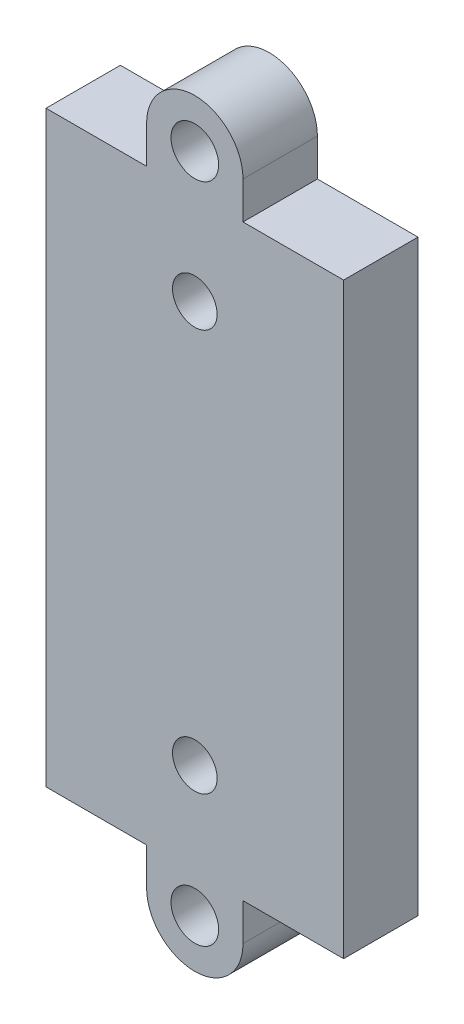
ISO-10303-21;
HEADER;
FILE_DESCRIPTION(('STEP AP214'),'2;1');
FILE_NAME('part.step','',(''),(''),'','','');
FILE_SCHEMA(('AUTOMOTIVE_DESIGN { 1 0 10303 214 1 1 1 1 }'));
ENDSEC;
DATA;
#1=APPLICATION_CONTEXT('core data for automotive mechanical design processes');
#2=APPLICATION_PROTOCOL_DEFINITION('international standard','automotive_design',2000,#1);
#3=PRODUCT_CONTEXT('',#1,'mechanical');
#4=PRODUCT('Part','Part','',(#3));
#5=PRODUCT_RELATED_PRODUCT_CATEGORY('part','',(#4));
#6=PRODUCT_DEFINITION_FORMATION('','',#4);
#7=PRODUCT_DEFINITION_CONTEXT('part definition',#1,'design');
#8=PRODUCT_DEFINITION('design','',#6,#7);
#9=PRODUCT_DEFINITION_SHAPE('','',#8);
#10=(LENGTH_UNIT() NAMED_UNIT(*) SI_UNIT(.MILLI.,.METRE.));
#11=(NAMED_UNIT(*) PLANE_ANGLE_UNIT() SI_UNIT($,.RADIAN.));
#12=(NAMED_UNIT(*) SI_UNIT($,.STERADIAN.) SOLID_ANGLE_UNIT());
#13=UNCERTAINTY_MEASURE_WITH_UNIT(LENGTH_MEASURE(1.E-05),#10,'distance_accuracy_value','');
#14=(GEOMETRIC_REPRESENTATION_CONTEXT(3) GLOBAL_UNCERTAINTY_ASSIGNED_CONTEXT((#13)) GLOBAL_UNIT_ASSIGNED_CONTEXT((#10,
#11,#12)) REPRESENTATION_CONTEXT('',''));
#15=CARTESIAN_POINT('',(0.,0.,0.));
#16=DIRECTION('',(0.,0.,1.));
#17=DIRECTION('',(1.,0.,0.));
#18=AXIS2_PLACEMENT_3D('',#15,#16,#17);
#19=CARTESIAN_POINT('',(-21.5845968576232,-26.2971291866029,5.));
#20=DIRECTION('',(0.,1.,0.));
#21=DIRECTION('',(-1.,0.,0.));
#22=AXIS2_PLACEMENT_3D('',#19,#20,#21);
#23=PLANE('',#22);
#24=DIRECTION('',(1.,0.,0.));
#25=VECTOR('',#24,1.);
#26=CARTESIAN_POINT('',(-21.5845968576232,-26.2971291866029,5.));
#27=LINE('',#26,#25);
#28=CARTESIAN_POINT('',(-5.84459685762318,-26.2971291866029,5.));
#29=VERTEX_POINT('',#28);
#30=CARTESIAN_POINT('',(0.915403142376816,-26.2971291866029,5.));
#31=VERTEX_POINT('',#30);
#32=EDGE_CURVE('E54',#29,#31,#27,.T.);
#33=ORIENTED_EDGE('',*,*,#32,.F.);
#34=DIRECTION('',(0.,0.,-1.));
#35=VECTOR('',#34,1.);
#36=CARTESIAN_POINT('',(-5.84459685762318,-26.2971291866029,5.));
#37=LINE('',#36,#35);
#38=CARTESIAN_POINT('',(-5.84459685762318,-26.2971291866029,0.));
#39=VERTEX_POINT('',#38);
#40=EDGE_CURVE('E11',#29,#39,#37,.T.);
#41=ORIENTED_EDGE('',*,*,#40,.T.);
#42=DIRECTION('',(1.,0.,0.));
#43=VECTOR('',#42,1.);
#44=CARTESIAN_POINT('',(-21.5845968576232,-26.2971291866029,0.));
#45=LINE('',#44,#43);
#46=CARTESIAN_POINT('',(0.915403142376817,-26.2971291866029,0.));
#47=VERTEX_POINT('',#46);
#48=EDGE_CURVE('E204',#39,#47,#45,.T.);
#49=ORIENTED_EDGE('',*,*,#48,.T.);
#50=DIRECTION('',(0.,0.,-1.));
#51=VECTOR('',#50,1.);
#52=CARTESIAN_POINT('',(0.915403142376816,-26.2971291866029,5.));
#53=LINE('',#52,#51);
#54=EDGE_CURVE('E195',#31,#47,#53,.T.);
#55=ORIENTED_EDGE('',*,*,#54,.F.);
#56=EDGE_LOOP('',(#33,#41,#49,#55));
#57=FACE_BOUND('',#56,.T.);
#58=ADVANCED_FACE('F32',(#57),#23,.F.);
#59=CARTESIAN_POINT('',(-4.03454117826684,-8.29712918660287,5.));
#60=DIRECTION('',(0.,0.,1.));
#61=DIRECTION('',(1.,0.,0.));
#62=AXIS2_PLACEMENT_3D('',#59,#60,#61);
#63=PLANE('',#62);
#64=CARTESIAN_POINT('',(-9.08459685762318,-20.0471291866029,5.));
#65=DIRECTION('',(0.,0.,1.));
#66=DIRECTION('',(1.,0.,0.));
#67=AXIS2_PLACEMENT_3D('',#64,#65,#66);
#68=CIRCLE('',#67,1.5);
#69=CARTESIAN_POINT('',(-7.58459685762318,-20.0471291866029,5.));
#70=VERTEX_POINT('',#69);
#71=EDGE_CURVE('E277',#70,#70,#68,.T.);
#72=ORIENTED_EDGE('',*,*,#71,.F.);
#73=EDGE_LOOP('',(#72));
#74=FACE_BOUND('',#73,.T.);
#75=CARTESIAN_POINT('',(-9.08459685762319,6.95287081339712,5.));
#76=DIRECTION('',(0.,0.,1.));
#77=DIRECTION('',(1.,0.,0.));
#78=AXIS2_PLACEMENT_3D('',#75,#76,#77);
#79=CIRCLE('',#78,1.5);
#80=CARTESIAN_POINT('',(-7.58459685762319,6.95287081339712,5.));
#81=VERTEX_POINT('',#80);
#82=EDGE_CURVE('E280',#81,#81,#79,.T.);
#83=ORIENTED_EDGE('',*,*,#82,.F.);
#84=EDGE_LOOP('',(#83));
#85=FACE_BOUND('',#84,.T.);
#86=DIRECTION('',(1.,0.,0.));
#87=VECTOR('',#86,1.);
#88=CARTESIAN_POINT('',(-19.0845968576232,13.2028708133971,5.));
#89=LINE('',#88,#87);
#90=CARTESIAN_POINT('',(-5.84459685762319,13.2028708133971,5.));
#91=VERTEX_POINT('',#90);
#92=CARTESIAN_POINT('',(0.915403142376817,13.2028708133971,5.));
#93=VERTEX_POINT('',#92);
#94=EDGE_CURVE('E153',#91,#93,#89,.T.);
#95=ORIENTED_EDGE('',*,*,#94,.F.);
#96=DIRECTION('',(0.,-1.,0.));
#97=VECTOR('',#96,1.);
#98=CARTESIAN_POINT('',(-5.84459685762319,13.2028708133971,5.));
#99=LINE('',#98,#97);
#100=CARTESIAN_POINT('',(-5.84459685762319,15.7028708133971,5.));
#101=VERTEX_POINT('',#100);
#102=EDGE_CURVE('E134',#101,#91,#99,.T.);
#103=ORIENTED_EDGE('',*,*,#102,.F.);
#104=CARTESIAN_POINT('',(-9.08459685762319,15.7028708133971,5.));
#105=DIRECTION('',(0.,0.,-1.));
#106=DIRECTION('',(1.,0.,0.));
#107=AXIS2_PLACEMENT_3D('',#104,#105,#106);
#108=CIRCLE('',#107,3.24);
#109=CARTESIAN_POINT('',(-12.3245968576232,15.7028708133971,5.));
#110=VERTEX_POINT('',#109);
#111=EDGE_CURVE('E146',#110,#101,#108,.T.);
#112=ORIENTED_EDGE('',*,*,#111,.F.);
#113=DIRECTION('',(0.,1.,0.));
#114=VECTOR('',#113,1.);
#115=CARTESIAN_POINT('',(-12.3245968576232,15.7028708133971,5.));
#116=LINE('',#115,#114);
#117=CARTESIAN_POINT('',(-12.3245968576232,13.2028708133971,5.));
#118=VERTEX_POINT('',#117);
#119=EDGE_CURVE('E126',#118,#110,#116,.T.);
#120=ORIENTED_EDGE('',*,*,#119,.F.);
#121=CARTESIAN_POINT('',(-19.0845968576232,13.2028708133971,5.));
#122=VERTEX_POINT('',#121);
#123=EDGE_CURVE('E143',#122,#118,#89,.T.);
#124=ORIENTED_EDGE('',*,*,#123,.F.);
#125=DIRECTION('',(0.,-1.,0.));
#126=VECTOR('',#125,1.);
#127=CARTESIAN_POINT('',(-19.0845968576232,-28.9494172005716,5.));
#128=LINE('',#127,#126);
#129=CARTESIAN_POINT('',(-19.0845968576232,-26.2971291866029,5.));
#130=VERTEX_POINT('',#129);
#131=EDGE_CURVE('E199',#122,#130,#128,.T.);
#132=ORIENTED_EDGE('',*,*,#131,.T.);
#133=CARTESIAN_POINT('',(-12.3245968576232,-26.2971291866029,5.));
#134=VERTEX_POINT('',#133);
#135=EDGE_CURVE('E205',#130,#134,#27,.T.);
#136=ORIENTED_EDGE('',*,*,#135,.T.);
#137=DIRECTION('',(0.,1.,0.));
#138=VECTOR('',#137,1.);
#139=CARTESIAN_POINT('',(-12.3245968576232,-28.7971291866029,5.));
#140=LINE('',#139,#138);
#141=CARTESIAN_POINT('',(-12.3245968576232,-28.7971291866029,5.));
#142=VERTEX_POINT('',#141);
#143=EDGE_CURVE('E179',#142,#134,#140,.T.);
#144=ORIENTED_EDGE('',*,*,#143,.F.);
#145=CARTESIAN_POINT('',(-9.08459685762318,-28.7971291866029,5.));
#146=DIRECTION('',(0.,0.,-1.));
#147=DIRECTION('',(-1.,0.,0.));
#148=AXIS2_PLACEMENT_3D('',#145,#146,#147);
#149=CIRCLE('',#148,3.24);
#150=CARTESIAN_POINT('',(-5.84459685762318,-28.7971291866029,5.));
#151=VERTEX_POINT('',#150);
#152=EDGE_CURVE('E176',#151,#142,#149,.T.);
#153=ORIENTED_EDGE('',*,*,#152,.F.);
#154=DIRECTION('',(0.,-1.,0.));
#155=VECTOR('',#154,1.);
#156=CARTESIAN_POINT('',(-5.84459685762318,-28.7971291866029,5.));
#157=LINE('',#156,#155);
#158=EDGE_CURVE('E183',#29,#151,#157,.T.);
#159=ORIENTED_EDGE('',*,*,#158,.F.);
#160=ORIENTED_EDGE('',*,*,#32,.T.);
#161=DIRECTION('',(0.,-1.,0.));
#162=VECTOR('',#161,1.);
#163=CARTESIAN_POINT('',(0.915403142376817,-8.29712918660287,5.));
#164=LINE('',#163,#162);
#165=EDGE_CURVE('E167',#93,#31,#164,.T.);
#166=ORIENTED_EDGE('',*,*,#165,.F.);
#167=EDGE_LOOP('',(#95,#103,#112,#120,#124,#132,#136,#144,#153,#159,#160,#166));
#168=FACE_BOUND('',#167,.T.);
#169=CARTESIAN_POINT('',(-9.08459685762318,-28.7971291866029,5.));
#170=DIRECTION('',(0.,0.,-1.));
#171=DIRECTION('',(-1.,0.,0.));
#172=AXIS2_PLACEMENT_3D('',#169,#170,#171);
#173=CIRCLE('',#172,1.6);
#174=CARTESIAN_POINT('',(-10.6845968576232,-28.7971291866029,5.));
#175=VERTEX_POINT('',#174);
#176=EDGE_CURVE('E170',#175,#175,#173,.T.);
#177=ORIENTED_EDGE('',*,*,#176,.T.);
#178=EDGE_LOOP('',(#177));
#179=FACE_BOUND('',#178,.T.);
#180=CARTESIAN_POINT('',(-9.08459685762319,15.7028708133971,5.));
#181=DIRECTION('',(0.,0.,-1.));
#182=DIRECTION('',(1.,0.,0.));
#183=AXIS2_PLACEMENT_3D('',#180,#181,#182);
#184=CIRCLE('',#183,1.6);
#185=CARTESIAN_POINT('',(-7.48459685762319,15.7028708133971,5.));
#186=VERTEX_POINT('',#185);
#187=EDGE_CURVE('E249',#186,#186,#184,.T.);
#188=ORIENTED_EDGE('',*,*,#187,.T.);
#189=EDGE_LOOP('',(#188));
#190=FACE_BOUND('',#189,.T.);
#191=ADVANCED_FACE('F140',(#74,#85,#168,#179,#190),#63,.T.);
#192=CARTESIAN_POINT('',(-4.03454117826684,-8.29712918660287,0.));
#193=DIRECTION('',(0.,0.,1.));
#194=DIRECTION('',(1.,0.,0.));
#195=AXIS2_PLACEMENT_3D('',#192,#193,#194);
#196=PLANE('',#195);
#197=CARTESIAN_POINT('',(-9.08459685762319,6.95287081339712,0.));
#198=DIRECTION('',(0.,0.,-1.));
#199=DIRECTION('',(1.,0.,0.));
#200=AXIS2_PLACEMENT_3D('',#197,#198,#199);
#201=CIRCLE('',#200,1.5);
#202=CARTESIAN_POINT('',(-7.58459685762319,6.95287081339712,0.));
#203=VERTEX_POINT('',#202);
#204=EDGE_CURVE('E287',#203,#203,#201,.T.);
#205=ORIENTED_EDGE('',*,*,#204,.F.);
#206=EDGE_LOOP('',(#205));
#207=FACE_BOUND('',#206,.T.);
#208=DIRECTION('',(0.,-1.,0.));
#209=VECTOR('',#208,1.);
#210=CARTESIAN_POINT('',(-5.84459685762319,13.2028708133971,0.));
#211=LINE('',#210,#209);
#212=CARTESIAN_POINT('',(-5.84459685762319,15.7028708133971,0.));
#213=VERTEX_POINT('',#212);
#214=CARTESIAN_POINT('',(-5.84459685762319,13.2028708133971,0.));
#215=VERTEX_POINT('',#214);
#216=EDGE_CURVE('E147',#213,#215,#211,.T.);
#217=ORIENTED_EDGE('',*,*,#216,.T.);
#218=DIRECTION('',(1.,0.,0.));
#219=VECTOR('',#218,1.);
#220=CARTESIAN_POINT('',(-19.0845968576232,13.2028708133971,0.));
#221=LINE('',#220,#219);
#222=CARTESIAN_POINT('',(0.915403142376817,13.2028708133971,0.));
#223=VERTEX_POINT('',#222);
#224=EDGE_CURVE('E161',#215,#223,#221,.T.);
#225=ORIENTED_EDGE('',*,*,#224,.T.);
#226=DIRECTION('',(0.,1.,0.));
#227=VECTOR('',#226,1.);
#228=CARTESIAN_POINT('',(0.915403142376817,-33.6306965097861,0.));
#229=LINE('',#228,#227);
#230=EDGE_CURVE('E163',#47,#223,#229,.T.);
#231=ORIENTED_EDGE('',*,*,#230,.F.);
#232=ORIENTED_EDGE('',*,*,#48,.F.);
#233=DIRECTION('',(0.,-1.,0.));
#234=VECTOR('',#233,1.);
#235=CARTESIAN_POINT('',(-5.84459685762318,-28.7971291866029,0.));
#236=LINE('',#235,#234);
#237=CARTESIAN_POINT('',(-5.84459685762318,-28.7971291866029,0.));
#238=VERTEX_POINT('',#237);
#239=EDGE_CURVE('E180',#39,#238,#236,.T.);
#240=ORIENTED_EDGE('',*,*,#239,.T.);
#241=CARTESIAN_POINT('',(-9.08459685762318,-28.7971291866029,0.));
#242=DIRECTION('',(0.,0.,-1.));
#243=DIRECTION('',(-1.,0.,0.));
#244=AXIS2_PLACEMENT_3D('',#241,#242,#243);
#245=CIRCLE('',#244,3.24);
#246=CARTESIAN_POINT('',(-12.3245968576232,-28.7971291866029,0.));
#247=VERTEX_POINT('',#246);
#248=EDGE_CURVE('E173',#238,#247,#245,.T.);
#249=ORIENTED_EDGE('',*,*,#248,.T.);
#250=DIRECTION('',(0.,1.,0.));
#251=VECTOR('',#250,1.);
#252=CARTESIAN_POINT('',(-12.3245968576232,-28.7971291866029,0.));
#253=LINE('',#252,#251);
#254=CARTESIAN_POINT('',(-12.3245968576232,-26.2971291866029,0.));
#255=VERTEX_POINT('',#254);
#256=EDGE_CURVE('E188',#247,#255,#253,.T.);
#257=ORIENTED_EDGE('',*,*,#256,.T.);
#258=CARTESIAN_POINT('',(-19.0845968576232,-26.2971291866029,0.));
#259=VERTEX_POINT('',#258);
#260=EDGE_CURVE('E47',#259,#255,#45,.T.);
#261=ORIENTED_EDGE('',*,*,#260,.F.);
#262=DIRECTION('',(0.,-1.,0.));
#263=VECTOR('',#262,1.);
#264=CARTESIAN_POINT('',(-19.0845968576232,-28.9494172005716,0.));
#265=LINE('',#264,#263);
#266=CARTESIAN_POINT('',(-19.0845968576232,13.2028708133971,0.));
#267=VERTEX_POINT('',#266);
#268=EDGE_CURVE('E198',#267,#259,#265,.T.);
#269=ORIENTED_EDGE('',*,*,#268,.F.);
#270=CARTESIAN_POINT('',(-12.3245968576232,13.2028708133971,0.));
#271=VERTEX_POINT('',#270);
#272=EDGE_CURVE('E157',#267,#271,#221,.T.);
#273=ORIENTED_EDGE('',*,*,#272,.T.);
#274=DIRECTION('',(0.,1.,0.));
#275=VECTOR('',#274,1.);
#276=CARTESIAN_POINT('',(-12.3245968576232,15.7028708133971,0.));
#277=LINE('',#276,#275);
#278=CARTESIAN_POINT('',(-12.3245968576232,15.7028708133971,0.));
#279=VERTEX_POINT('',#278);
#280=EDGE_CURVE('E128',#271,#279,#277,.T.);
#281=ORIENTED_EDGE('',*,*,#280,.T.);
#282=CARTESIAN_POINT('',(-9.08459685762319,15.7028708133971,0.));
#283=DIRECTION('',(0.,0.,-1.));
#284=DIRECTION('',(1.,0.,0.));
#285=AXIS2_PLACEMENT_3D('',#282,#283,#284);
#286=CIRCLE('',#285,3.24);
#287=EDGE_CURVE('E248',#279,#213,#286,.T.);
#288=ORIENTED_EDGE('',*,*,#287,.T.);
#289=EDGE_LOOP('',(#217,#225,#231,#232,#240,#249,#257,#261,#269,#273,#281,#288));
#290=FACE_BOUND('',#289,.T.);
#291=CARTESIAN_POINT('',(-9.08459685762318,-20.0471291866029,0.));
#292=DIRECTION('',(0.,0.,-1.));
#293=DIRECTION('',(-1.,0.,0.));
#294=AXIS2_PLACEMENT_3D('',#291,#292,#293);
#295=CIRCLE('',#294,1.5);
#296=CARTESIAN_POINT('',(-10.5845968576232,-20.0471291866029,0.));
#297=VERTEX_POINT('',#296);
#298=EDGE_CURVE('E282',#297,#297,#295,.T.);
#299=ORIENTED_EDGE('',*,*,#298,.F.);
#300=EDGE_LOOP('',(#299));
#301=FACE_BOUND('',#300,.T.);
#302=CARTESIAN_POINT('',(-9.08459685762318,-28.7971291866029,0.));
#303=DIRECTION('',(0.,0.,-1.));
#304=DIRECTION('',(-1.,0.,0.));
#305=AXIS2_PLACEMENT_3D('',#302,#303,#304);
#306=CIRCLE('',#305,1.6);
#307=CARTESIAN_POINT('',(-10.6845968576232,-28.7971291866029,0.));
#308=VERTEX_POINT('',#307);
#309=EDGE_CURVE('E169',#308,#308,#306,.T.);
#310=ORIENTED_EDGE('',*,*,#309,.F.);
#311=EDGE_LOOP('',(#310));
#312=FACE_BOUND('',#311,.T.);
#313=CARTESIAN_POINT('',(-9.08459685762319,15.7028708133971,0.));
#314=DIRECTION('',(0.,0.,-1.));
#315=DIRECTION('',(1.,0.,0.));
#316=AXIS2_PLACEMENT_3D('',#313,#314,#315);
#317=CIRCLE('',#316,1.6);
#318=CARTESIAN_POINT('',(-7.48459685762319,15.7028708133971,0.));
#319=VERTEX_POINT('',#318);
#320=EDGE_CURVE('E284',#319,#319,#317,.T.);
#321=ORIENTED_EDGE('',*,*,#320,.F.);
#322=EDGE_LOOP('',(#321));
#323=FACE_BOUND('',#322,.T.);
#324=ADVANCED_FACE('F34',(#207,#290,#301,#312,#323),#196,.F.);
#325=ORIENTED_EDGE('',*,*,#260,.T.);
#326=DIRECTION('',(0.,0.,1.));
#327=VECTOR('',#326,1.);
#328=CARTESIAN_POINT('',(-12.3245968576232,-26.2971291866029,5.));
#329=LINE('',#328,#327);
#330=EDGE_CURVE('E40',#255,#134,#329,.T.);
#331=ORIENTED_EDGE('',*,*,#330,.T.);
#332=ORIENTED_EDGE('',*,*,#135,.F.);
#333=DIRECTION('',(0.,0.,-1.));
#334=VECTOR('',#333,1.);
#335=CARTESIAN_POINT('',(-19.0845968576232,-26.2971291866029,5.));
#336=LINE('',#335,#334);
#337=EDGE_CURVE('E201',#130,#259,#336,.T.);
#338=ORIENTED_EDGE('',*,*,#337,.T.);
#339=EDGE_LOOP('',(#325,#331,#332,#338));
#340=FACE_BOUND('',#339,.T.);
#341=ADVANCED_FACE('F209',(#340),#23,.F.);
#342=CARTESIAN_POINT('',(-19.0845968576232,-28.9494172005716,5.));
#343=DIRECTION('',(1.,0.,0.));
#344=DIRECTION('',(0.,0.,-1.));
#345=AXIS2_PLACEMENT_3D('',#342,#343,#344);
#346=PLANE('',#345);
#347=ORIENTED_EDGE('',*,*,#131,.F.);
#348=DIRECTION('',(0.,0.,-1.));
#349=VECTOR('',#348,1.);
#350=CARTESIAN_POINT('',(-19.0845968576232,13.2028708133971,5.));
#351=LINE('',#350,#349);
#352=EDGE_CURVE('E152',#122,#267,#351,.T.);
#353=ORIENTED_EDGE('',*,*,#352,.T.);
#354=ORIENTED_EDGE('',*,*,#268,.T.);
#355=ORIENTED_EDGE('',*,*,#337,.F.);
#356=EDGE_LOOP('',(#347,#353,#354,#355));
#357=FACE_BOUND('',#356,.T.);
#358=ADVANCED_FACE('F255',(#357),#346,.F.);
#359=CARTESIAN_POINT('',(-5.84459685762318,-28.7971291866029,5.));
#360=DIRECTION('',(1.,0.,0.));
#361=DIRECTION('',(0.,0.,-1.));
#362=AXIS2_PLACEMENT_3D('',#359,#360,#361);
#363=PLANE('',#362);
#364=ORIENTED_EDGE('',*,*,#40,.F.);
#365=ORIENTED_EDGE('',*,*,#158,.T.);
#366=DIRECTION('',(0.,0.,-1.));
#367=VECTOR('',#366,1.);
#368=CARTESIAN_POINT('',(-5.84459685762318,-28.7971291866029,5.));
#369=LINE('',#368,#367);
#370=EDGE_CURVE('E192',#151,#238,#369,.T.);
#371=ORIENTED_EDGE('',*,*,#370,.T.);
#372=ORIENTED_EDGE('',*,*,#239,.F.);
#373=EDGE_LOOP('',(#364,#365,#371,#372));
#374=FACE_BOUND('',#373,.T.);
#375=ADVANCED_FACE('F222',(#374),#363,.T.);
#376=CARTESIAN_POINT('',(-12.3245968576232,-28.7971291866029,5.));
#377=DIRECTION('',(-1.,0.,0.));
#378=DIRECTION('',(0.,0.,1.));
#379=AXIS2_PLACEMENT_3D('',#376,#377,#378);
#380=PLANE('',#379);
#381=ORIENTED_EDGE('',*,*,#330,.F.);
#382=ORIENTED_EDGE('',*,*,#256,.F.);
#383=DIRECTION('',(0.,0.,-1.));
#384=VECTOR('',#383,1.);
#385=CARTESIAN_POINT('',(-12.3245968576232,-28.7971291866029,5.));
#386=LINE('',#385,#384);
#387=EDGE_CURVE('E185',#142,#247,#386,.T.);
#388=ORIENTED_EDGE('',*,*,#387,.F.);
#389=ORIENTED_EDGE('',*,*,#143,.T.);
#390=EDGE_LOOP('',(#381,#382,#388,#389));
#391=FACE_BOUND('',#390,.T.);
#392=ADVANCED_FACE('F214',(#391),#380,.T.);
#393=CARTESIAN_POINT('',(-9.08459685762318,-28.7971291866029,5.));
#394=DIRECTION('',(0.,0.,-1.));
#395=DIRECTION('',(-1.,0.,0.));
#396=AXIS2_PLACEMENT_3D('',#393,#394,#395);
#397=CYLINDRICAL_SURFACE('',#396,3.24);
#398=ORIENTED_EDGE('',*,*,#248,.F.);
#399=ORIENTED_EDGE('',*,*,#370,.F.);
#400=ORIENTED_EDGE('',*,*,#152,.T.);
#401=ORIENTED_EDGE('',*,*,#387,.T.);
#402=EDGE_LOOP('',(#398,#399,#400,#401));
#403=FACE_BOUND('',#402,.T.);
#404=ADVANCED_FACE('F217',(#403),#397,.T.);
#405=CARTESIAN_POINT('',(-9.08459685762318,-28.7971291866029,5.));
#406=DIRECTION('',(0.,0.,-1.));
#407=DIRECTION('',(-1.,0.,0.));
#408=AXIS2_PLACEMENT_3D('',#405,#406,#407);
#409=CYLINDRICAL_SURFACE('',#408,1.6);
#410=ORIENTED_EDGE('',*,*,#176,.F.);
#411=EDGE_LOOP('',(#410));
#412=FACE_BOUND('',#411,.T.);
#413=ORIENTED_EDGE('',*,*,#309,.T.);
#414=EDGE_LOOP('',(#413));
#415=FACE_BOUND('',#414,.T.);
#416=ADVANCED_FACE('F320',(#412,#415),#409,.F.);
#417=CARTESIAN_POINT('',(0.915403142376817,-33.6306965097861,10.));
#418=DIRECTION('',(-1.,0.,0.));
#419=DIRECTION('',(0.,0.,1.));
#420=AXIS2_PLACEMENT_3D('',#417,#418,#419);
#421=PLANE('',#420);
#422=ORIENTED_EDGE('',*,*,#165,.T.);
#423=ORIENTED_EDGE('',*,*,#54,.T.);
#424=ORIENTED_EDGE('',*,*,#230,.T.);
#425=DIRECTION('',(0.,0.,-1.));
#426=VECTOR('',#425,1.);
#427=CARTESIAN_POINT('',(0.915403142376817,13.2028708133971,5.));
#428=LINE('',#427,#426);
#429=EDGE_CURVE('E155',#93,#223,#428,.T.);
#430=ORIENTED_EDGE('',*,*,#429,.F.);
#431=EDGE_LOOP('',(#422,#423,#424,#430));
#432=FACE_BOUND('',#431,.T.);
#433=ADVANCED_FACE('F232',(#432),#421,.F.);
#434=CARTESIAN_POINT('',(-19.0845968576232,13.2028708133971,5.));
#435=DIRECTION('',(0.,1.,0.));
#436=DIRECTION('',(0.,0.,1.));
#437=AXIS2_PLACEMENT_3D('',#434,#435,#436);
#438=PLANE('',#437);
#439=DIRECTION('',(0.,0.,-1.));
#440=VECTOR('',#439,1.);
#441=CARTESIAN_POINT('',(-5.84459685762319,13.2028708133971,5.));
#442=LINE('',#441,#440);
#443=EDGE_CURVE('E236',#91,#215,#442,.T.);
#444=ORIENTED_EDGE('',*,*,#443,.F.);
#445=ORIENTED_EDGE('',*,*,#94,.T.);
#446=ORIENTED_EDGE('',*,*,#429,.T.);
#447=ORIENTED_EDGE('',*,*,#224,.F.);
#448=EDGE_LOOP('',(#444,#445,#446,#447));
#449=FACE_BOUND('',#448,.T.);
#450=ADVANCED_FACE('F235',(#449),#438,.T.);
#451=DIRECTION('',(0.,0.,-1.));
#452=VECTOR('',#451,1.);
#453=CARTESIAN_POINT('',(-12.3245968576232,13.2028708133971,5.));
#454=LINE('',#453,#452);
#455=EDGE_CURVE('E123',#118,#271,#454,.T.);
#456=ORIENTED_EDGE('',*,*,#455,.T.);
#457=ORIENTED_EDGE('',*,*,#272,.F.);
#458=ORIENTED_EDGE('',*,*,#352,.F.);
#459=ORIENTED_EDGE('',*,*,#123,.T.);
#460=EDGE_LOOP('',(#456,#457,#458,#459));
#461=FACE_BOUND('',#460,.T.);
#462=ADVANCED_FACE('F150',(#461),#438,.T.);
#463=CARTESIAN_POINT('',(-5.84459685762319,13.2028708133971,5.));
#464=DIRECTION('',(1.,0.,0.));
#465=DIRECTION('',(0.,0.,-1.));
#466=AXIS2_PLACEMENT_3D('',#463,#464,#465);
#467=PLANE('',#466);
#468=ORIENTED_EDGE('',*,*,#216,.F.);
#469=DIRECTION('',(0.,0.,-1.));
#470=VECTOR('',#469,1.);
#471=CARTESIAN_POINT('',(-5.84459685762319,15.7028708133971,5.));
#472=LINE('',#471,#470);
#473=EDGE_CURVE('E242',#101,#213,#472,.T.);
#474=ORIENTED_EDGE('',*,*,#473,.F.);
#475=ORIENTED_EDGE('',*,*,#102,.T.);
#476=ORIENTED_EDGE('',*,*,#443,.T.);
#477=EDGE_LOOP('',(#468,#474,#475,#476));
#478=FACE_BOUND('',#477,.T.);
#479=ADVANCED_FACE('F311',(#478),#467,.T.);
#480=CARTESIAN_POINT('',(-9.08459685762319,15.7028708133971,5.));
#481=DIRECTION('',(0.,0.,-1.));
#482=DIRECTION('',(-1.,0.,0.));
#483=AXIS2_PLACEMENT_3D('',#480,#481,#482);
#484=CYLINDRICAL_SURFACE('',#483,3.24);
#485=ORIENTED_EDGE('',*,*,#287,.F.);
#486=DIRECTION('',(0.,0.,-1.));
#487=VECTOR('',#486,1.);
#488=CARTESIAN_POINT('',(-12.3245968576232,15.7028708133971,5.));
#489=LINE('',#488,#487);
#490=EDGE_CURVE('E133',#110,#279,#489,.T.);
#491=ORIENTED_EDGE('',*,*,#490,.F.);
#492=ORIENTED_EDGE('',*,*,#111,.T.);
#493=ORIENTED_EDGE('',*,*,#473,.T.);
#494=EDGE_LOOP('',(#485,#491,#492,#493));
#495=FACE_BOUND('',#494,.T.);
#496=ADVANCED_FACE('F241',(#495),#484,.T.);
#497=CARTESIAN_POINT('',(-12.3245968576232,15.7028708133971,5.));
#498=DIRECTION('',(-1.,0.,0.));
#499=DIRECTION('',(0.,-1.,0.));
#500=AXIS2_PLACEMENT_3D('',#497,#498,#499);
#501=PLANE('',#500);
#502=ORIENTED_EDGE('',*,*,#280,.F.);
#503=ORIENTED_EDGE('',*,*,#455,.F.);
#504=ORIENTED_EDGE('',*,*,#119,.T.);
#505=ORIENTED_EDGE('',*,*,#490,.T.);
#506=EDGE_LOOP('',(#502,#503,#504,#505));
#507=FACE_BOUND('',#506,.T.);
#508=ADVANCED_FACE('F125',(#507),#501,.T.);
#509=CARTESIAN_POINT('',(-9.08459685762319,15.7028708133971,5.));
#510=DIRECTION('',(0.,0.,-1.));
#511=DIRECTION('',(-1.,0.,0.));
#512=AXIS2_PLACEMENT_3D('',#509,#510,#511);
#513=CYLINDRICAL_SURFACE('',#512,1.6);
#514=ORIENTED_EDGE('',*,*,#187,.F.);
#515=EDGE_LOOP('',(#514));
#516=FACE_BOUND('',#515,.T.);
#517=ORIENTED_EDGE('',*,*,#320,.T.);
#518=EDGE_LOOP('',(#517));
#519=FACE_BOUND('',#518,.T.);
#520=ADVANCED_FACE('F295',(#516,#519),#513,.F.);
#521=CARTESIAN_POINT('',(-9.08459685762319,6.95287081339712,10.));
#522=DIRECTION('',(0.,0.,-1.));
#523=DIRECTION('',(-1.,0.,0.));
#524=AXIS2_PLACEMENT_3D('',#521,#522,#523);
#525=CYLINDRICAL_SURFACE('',#524,1.5);
#526=ORIENTED_EDGE('',*,*,#82,.T.);
#527=EDGE_LOOP('',(#526));
#528=FACE_BOUND('',#527,.T.);
#529=ORIENTED_EDGE('',*,*,#204,.T.);
#530=EDGE_LOOP('',(#529));
#531=FACE_BOUND('',#530,.T.);
#532=ADVANCED_FACE('F298',(#528,#531),#525,.F.);
#533=CARTESIAN_POINT('',(-9.08459685762318,-20.0471291866029,10.));
#534=DIRECTION('',(0.,0.,-1.));
#535=DIRECTION('',(-1.,0.,0.));
#536=AXIS2_PLACEMENT_3D('',#533,#534,#535);
#537=CYLINDRICAL_SURFACE('',#536,1.5);
#538=ORIENTED_EDGE('',*,*,#71,.T.);
#539=EDGE_LOOP('',(#538));
#540=FACE_BOUND('',#539,.T.);
#541=ORIENTED_EDGE('',*,*,#298,.T.);
#542=EDGE_LOOP('',(#541));
#543=FACE_BOUND('',#542,.T.);
#544=ADVANCED_FACE('F305',(#540,#543),#537,.F.);
#545=CLOSED_SHELL('',(#58,#191,#324,#341,#358,#375,#392,#404,#416,#433,#450,#462,#479,#496,#508,
#520,#532,#544));
#546=MANIFOLD_SOLID_BREP('B2',#545);
#547=ADVANCED_BREP_SHAPE_REPRESENTATION('',(#18,#546),#14);
#548=SHAPE_DEFINITION_REPRESENTATION(#9,#547);
ENDSEC;
END-ISO-10303-21;
